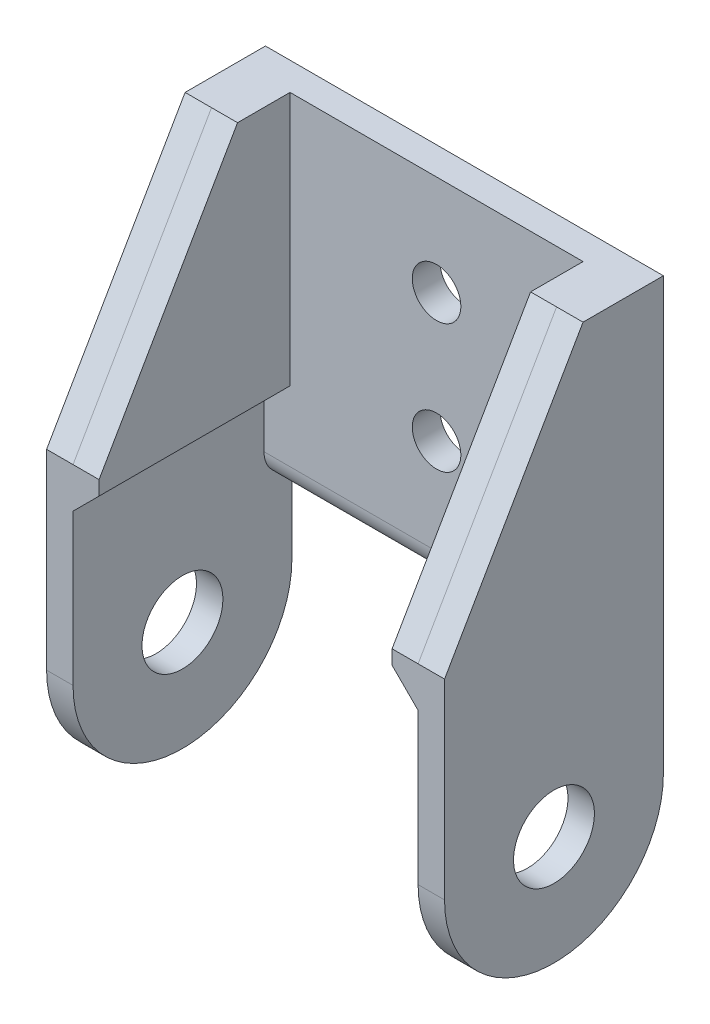
ISO-10303-21;
HEADER;
FILE_DESCRIPTION(('STEP AP214'),'2;1');
FILE_NAME('part.step','',(''),(''),'','','');
FILE_SCHEMA(('AUTOMOTIVE_DESIGN { 1 0 10303 214 1 1 1 1 }'));
ENDSEC;
DATA;
#1=APPLICATION_CONTEXT('core data for automotive mechanical design processes');
#2=APPLICATION_PROTOCOL_DEFINITION('international standard','automotive_design',2000,#1);
#3=PRODUCT_CONTEXT('',#1,'mechanical');
#4=PRODUCT('Part','Part','',(#3));
#5=PRODUCT_RELATED_PRODUCT_CATEGORY('part','',(#4));
#6=PRODUCT_DEFINITION_FORMATION('','',#4);
#7=PRODUCT_DEFINITION_CONTEXT('part definition',#1,'design');
#8=PRODUCT_DEFINITION('design','',#6,#7);
#9=PRODUCT_DEFINITION_SHAPE('','',#8);
#10=(LENGTH_UNIT() NAMED_UNIT(*) SI_UNIT(.MILLI.,.METRE.));
#11=(NAMED_UNIT(*) PLANE_ANGLE_UNIT() SI_UNIT($,.RADIAN.));
#12=(NAMED_UNIT(*) SI_UNIT($,.STERADIAN.) SOLID_ANGLE_UNIT());
#13=UNCERTAINTY_MEASURE_WITH_UNIT(LENGTH_MEASURE(1.E-05),#10,'distance_accuracy_value','');
#14=(GEOMETRIC_REPRESENTATION_CONTEXT(3) GLOBAL_UNCERTAINTY_ASSIGNED_CONTEXT((#13)) GLOBAL_UNIT_ASSIGNED_CONTEXT((#10,
#11,#12)) REPRESENTATION_CONTEXT('',''));
#15=CARTESIAN_POINT('',(0.,0.,0.));
#16=DIRECTION('',(0.,0.,1.));
#17=DIRECTION('',(1.,0.,0.));
#18=AXIS2_PLACEMENT_3D('',#15,#16,#17);
#19=CARTESIAN_POINT('',(95.6580659340659,19.9474999999992,15.4123940140867));
#20=DIRECTION('',(0.,1.,0.));
#21=DIRECTION('',(1.,0.,0.));
#22=AXIS2_PLACEMENT_3D('',#19,#20,#21);
#23=PLANE('',#22);
#24=CARTESIAN_POINT('',(-13.92,19.9475,0.));
#25=CARTESIAN_POINT('',(13.92,19.9475,0.));
#26=(BOUNDED_CURVE() B_SPLINE_CURVE(1,(#24,#25),.UNSPECIFIED.,.F.,
.F.) B_SPLINE_CURVE_WITH_KNOTS((2,2),(-0.182,0.),
.UNSPECIFIED.) CURVE() GEOMETRIC_REPRESENTATION_ITEM() RATIONAL_B_SPLINE_CURVE((1.,1.)) REPRESENTATION_ITEM(''));
#27=CARTESIAN_POINT('',(-12.07,19.9475,0.));
#28=VERTEX_POINT('',#27);
#29=CARTESIAN_POINT('',(12.07,19.9475000013429,-1.55333731988172E-09));
#30=VERTEX_POINT('',#29);
#31=EDGE_CURVE('E378',#28,#30,#26,.T.);
#32=ORIENTED_EDGE('',*,*,#31,.F.);
#33=DIRECTION('',(1.,0.,0.));
#34=VECTOR('',#33,1.);
#35=CARTESIAN_POINT('',(-13.92,19.9475,0.));
#36=LINE('',#35,#34);
#37=CARTESIAN_POINT('',(-13.92,19.9475,0.));
#38=VERTEX_POINT('',#37);
#39=EDGE_CURVE('E633',#38,#28,#36,.T.);
#40=ORIENTED_EDGE('',*,*,#39,.F.);
#41=DIRECTION('',(0.,0.,-1.));
#42=VECTOR('',#41,1.);
#43=CARTESIAN_POINT('',(-13.92,19.9475,0.));
#44=LINE('',#43,#42);
#45=CARTESIAN_POINT('',(-13.92,19.9475,5.62206248299806));
#46=VERTEX_POINT('',#45);
#47=EDGE_CURVE('E646',#46,#38,#44,.T.);
#48=ORIENTED_EDGE('',*,*,#47,.F.);
#49=DIRECTION('',(1.,0.,0.));
#50=VECTOR('',#49,1.);
#51=CARTESIAN_POINT('',(-13.92,19.9475,5.62206248299806));
#52=LINE('',#51,#50);
#53=CARTESIAN_POINT('',(-12.0700000001218,19.94748992602,5.62207179111741));
#54=VERTEX_POINT('',#53);
#55=EDGE_CURVE('E657',#46,#54,#52,.T.);
#56=ORIENTED_EDGE('',*,*,#55,.T.);
#57=CARTESIAN_POINT('',(-10.25,19.9474544202722,5.62208880461831));
#58=CARTESIAN_POINT('',(-11.4733333333332,19.9474696135148,5.62208003074489));
#59=CARTESIAN_POINT('',(-12.6966666666666,19.9474848067574,5.62207125687148));
#60=CARTESIAN_POINT('',(-13.92,19.9475,5.62206248299806));
#61=(BOUNDED_CURVE() B_SPLINE_CURVE(3,(#57,#58,#59,#60),.UNSPECIFIED.,.F.,
.F.) B_SPLINE_CURVE_WITH_KNOTS((4,4),(0.,1.82000000076109),
.UNSPECIFIED.) CURVE() GEOMETRIC_REPRESENTATION_ITEM() RATIONAL_B_SPLINE_CURVE((1.,1.,1.,1.)) REPRESENTATION_ITEM(''));
#62=CARTESIAN_POINT('',(-10.25,19.9474726521634,5.62207827597021));
#63=VERTEX_POINT('',#62);
#64=EDGE_CURVE('E373',#54,#63,#61,.F.);
#65=ORIENTED_EDGE('',*,*,#64,.T.);
#66=CARTESIAN_POINT('',(-10.25,19.9471392113303,1.94999997565309));
#67=DIRECTION('',(0.,9.08043904448818E-05,0.999999995877281));
#68=VECTOR('',#67,1.);
#69=LINE('',#66,#68);
#70=CARTESIAN_POINT('',(-10.25,19.9471392113303,1.94999997565309));
#71=VERTEX_POINT('',#70);
#72=EDGE_CURVE('E318',#71,#63,#69,.T.);
#73=ORIENTED_EDGE('',*,*,#72,.F.);
#74=CARTESIAN_POINT('',(-10.2500000000001,19.9474999999992,1.9499999756531));
#75=DIRECTION('',(1.,0.,0.));
#76=VECTOR('',#75,1.);
#77=LINE('',#74,#76);
#78=CARTESIAN_POINT('',(10.25,19.9471392113302,1.94999997565309));
#79=VERTEX_POINT('',#78);
#80=EDGE_CURVE('E13',#71,#79,#77,.T.);
#81=ORIENTED_EDGE('',*,*,#80,.T.);
#82=CARTESIAN_POINT('',(10.25,19.9474999999992,1.9499999756531));
#83=DIRECTION('',(0.,0.,1.));
#84=VECTOR('',#83,1.);
#85=LINE('',#82,#84);
#86=CARTESIAN_POINT('',(10.25,19.9474726521633,5.62207827597021));
#87=VERTEX_POINT('',#86);
#88=EDGE_CURVE('E64',#79,#87,#85,.T.);
#89=ORIENTED_EDGE('',*,*,#88,.T.);
#90=CARTESIAN_POINT('',(13.92,19.9475,5.62206248299806));
#91=CARTESIAN_POINT('',(12.6966666666666,19.9474848067574,5.62207125687148));
#92=CARTESIAN_POINT('',(11.4733333333332,19.9474696135148,5.62208003074489));
#93=CARTESIAN_POINT('',(10.25,19.9474544202722,5.62208880461831));
#94=(BOUNDED_CURVE() B_SPLINE_CURVE(3,(#90,#91,#92,#93),.UNSPECIFIED.,.F.,
.F.) B_SPLINE_CURVE_WITH_KNOTS((4,4),(0.,1.82000000076108),
.UNSPECIFIED.) CURVE() GEOMETRIC_REPRESENTATION_ITEM() RATIONAL_B_SPLINE_CURVE((1.,1.,1.,1.)) REPRESENTATION_ITEM(''));
#95=CARTESIAN_POINT('',(12.07,19.9474885122572,5.62206911700006));
#96=VERTEX_POINT('',#95);
#97=EDGE_CURVE('E939',#87,#96,#94,.F.);
#98=ORIENTED_EDGE('',*,*,#97,.T.);
#99=DIRECTION('',(-1.,0.,0.));
#100=VECTOR('',#99,1.);
#101=CARTESIAN_POINT('',(13.92,19.9475000013429,5.62206248377335));
#102=LINE('',#101,#100);
#103=CARTESIAN_POINT('',(13.92,19.9475000013429,5.62206248377335));
#104=VERTEX_POINT('',#103);
#105=EDGE_CURVE('E674',#104,#96,#102,.T.);
#106=ORIENTED_EDGE('',*,*,#105,.F.);
#107=DIRECTION('',(0.,0.,1.));
#108=VECTOR('',#107,1.);
#109=CARTESIAN_POINT('',(13.92,19.9475000013429,5.62206248377335));
#110=LINE('',#109,#108);
#111=CARTESIAN_POINT('',(13.92,19.9475000013429,-1.55333731988172E-09));
#112=VERTEX_POINT('',#111);
#113=EDGE_CURVE('E693',#112,#104,#110,.T.);
#114=ORIENTED_EDGE('',*,*,#113,.F.);
#115=DIRECTION('',(-1.,0.,0.));
#116=VECTOR('',#115,1.);
#117=CARTESIAN_POINT('',(13.92,19.9475000013429,-1.55333731988172E-09));
#118=LINE('',#117,#116);
#119=EDGE_CURVE('E671',#112,#30,#118,.T.);
#120=ORIENTED_EDGE('',*,*,#119,.T.);
#121=EDGE_LOOP('',(#32,#40,#48,#56,#65,#73,#81,#89,#98,#106,#114,#120));
#122=FACE_BOUND('',#121,.T.);
#123=ADVANCED_FACE('F53',(#122),#23,.T.);
#124=CARTESIAN_POINT('',(-16.269,-11.7925,0.));
#125=DIRECTION('',(0.,0.,-1.));
#126=DIRECTION('',(0.,-1.,0.));
#127=AXIS2_PLACEMENT_3D('',#124,#125,#126);
#128=PLANE('',#127);
#129=CARTESIAN_POINT('',(0.,3.9475,0.));
#130=DIRECTION('',(0.,0.,-1.));
#131=DIRECTION('',(-1.,0.,0.));
#132=AXIS2_PLACEMENT_3D('',#129,#130,#131);
#133=CIRCLE('',#132,1.7);
#134=CARTESIAN_POINT('',(-1.7,3.9475,0.));
#135=VERTEX_POINT('',#134);
#136=EDGE_CURVE('E704',#135,#135,#133,.T.);
#137=ORIENTED_EDGE('',*,*,#136,.F.);
#138=EDGE_LOOP('',(#137));
#139=FACE_BOUND('',#138,.T.);
#140=CARTESIAN_POINT('',(0.,12.9475,0.));
#141=DIRECTION('',(0.,0.,-1.));
#142=DIRECTION('',(-1.,0.,0.));
#143=AXIS2_PLACEMENT_3D('',#140,#141,#142);
#144=CIRCLE('',#143,1.7);
#145=CARTESIAN_POINT('',(-1.7,12.9475,0.));
#146=VERTEX_POINT('',#145);
#147=EDGE_CURVE('E701',#146,#146,#144,.T.);
#148=ORIENTED_EDGE('',*,*,#147,.F.);
#149=EDGE_LOOP('',(#148));
#150=FACE_BOUND('',#149,.T.);
#151=CARTESIAN_POINT('',(-12.07,-4.6825,0.));
#152=CARTESIAN_POINT('',(12.07,-4.6825,0.));
#153=(BOUNDED_CURVE() B_SPLINE_CURVE(1,(#151,#152),.UNSPECIFIED.,.F.,
.F.) B_SPLINE_CURVE_WITH_KNOTS((2,2),(55.538,57.452),
.UNSPECIFIED.) CURVE() GEOMETRIC_REPRESENTATION_ITEM() RATIONAL_B_SPLINE_CURVE((1.,1.)) REPRESENTATION_ITEM(''));
#154=CARTESIAN_POINT('',(-12.07,-4.6825,0.));
#155=VERTEX_POINT('',#154);
#156=CARTESIAN_POINT('',(12.07,-4.68249999999999,-1.55334015319048E-09));
#157=VERTEX_POINT('',#156);
#158=EDGE_CURVE('E288',#155,#157,#153,.T.);
#159=ORIENTED_EDGE('',*,*,#158,.F.);
#160=DIRECTION('',(0.,-1.,0.));
#161=VECTOR('',#160,1.);
#162=CARTESIAN_POINT('',(-12.07,-10.2125,0.));
#163=LINE('',#162,#161);
#164=CARTESIAN_POINT('',(-12.07,-10.2125,0.));
#165=VERTEX_POINT('',#164);
#166=EDGE_CURVE('E650',#155,#165,#163,.T.);
#167=ORIENTED_EDGE('',*,*,#166,.T.);
#168=DIRECTION('',(1.,0.,0.));
#169=VECTOR('',#168,1.);
#170=CARTESIAN_POINT('',(-13.92,-10.2125,0.));
#171=LINE('',#170,#169);
#172=CARTESIAN_POINT('',(-13.92,-10.2125,0.));
#173=VERTEX_POINT('',#172);
#174=EDGE_CURVE('E636',#173,#165,#171,.T.);
#175=ORIENTED_EDGE('',*,*,#174,.F.);
#176=DIRECTION('',(0.,-1.,0.));
#177=VECTOR('',#176,1.);
#178=CARTESIAN_POINT('',(-13.92,-10.2125,0.));
#179=LINE('',#178,#177);
#180=EDGE_CURVE('E664',#38,#173,#179,.T.);
#181=ORIENTED_EDGE('',*,*,#180,.F.);
#182=ORIENTED_EDGE('',*,*,#39,.T.);
#183=ORIENTED_EDGE('',*,*,#31,.T.);
#184=ORIENTED_EDGE('',*,*,#119,.F.);
#185=DIRECTION('',(0.,1.,0.));
#186=VECTOR('',#185,1.);
#187=CARTESIAN_POINT('',(13.92,19.9475000013429,-1.55333731988172E-09));
#188=LINE('',#187,#186);
#189=CARTESIAN_POINT('',(13.92,-10.2124598604408,-1.55334078932867E-09));
#190=VERTEX_POINT('',#189);
#191=EDGE_CURVE('E696',#190,#112,#188,.T.);
#192=ORIENTED_EDGE('',*,*,#191,.F.);
#193=DIRECTION('',(-1.,0.,0.));
#194=VECTOR('',#193,1.);
#195=CARTESIAN_POINT('',(13.92,-10.2124598604408,-1.55334078932867E-09));
#196=LINE('',#195,#194);
#197=CARTESIAN_POINT('',(12.07,-10.2124598604408,-1.55334078932867E-09));
#198=VERTEX_POINT('',#197);
#199=EDGE_CURVE('E653',#190,#198,#196,.T.);
#200=ORIENTED_EDGE('',*,*,#199,.T.);
#201=DIRECTION('',(0.,1.,0.));
#202=VECTOR('',#201,1.);
#203=CARTESIAN_POINT('',(12.07,19.9475000013429,-1.55333731988172E-09));
#204=LINE('',#203,#202);
#205=EDGE_CURVE('E682',#198,#157,#204,.T.);
#206=ORIENTED_EDGE('',*,*,#205,.T.);
#207=EDGE_LOOP('',(#159,#167,#175,#181,#182,#183,#184,#192,#200,#206));
#208=FACE_BOUND('',#207,.T.);
#209=ADVANCED_FACE('F348',(#139,#150,#208),#128,.T.);
#210=CARTESIAN_POINT('',(-13.92,10.2629827701714,15.31));
#211=DIRECTION('',(0.,0.,1.));
#212=DIRECTION('',(1.,0.,0.));
#213=AXIS2_PLACEMENT_3D('',#210,#211,#212);
#214=PLANE('',#213);
#215=CARTESIAN_POINT('',(-13.92,3.1675,15.31));
#216=CARTESIAN_POINT('',(-12.07,3.1675,15.31));
#217=CARTESIAN_POINT('',(-10.25,3.1675,15.31));
#218=(BOUNDED_CURVE() B_SPLINE_CURVE(1,(#215,#216,#217),.UNSPECIFIED.,.F.,
.F.) B_SPLINE_CURVE_WITH_KNOTS((2,1,2),(-1.82000000076109,-0.902561308279338,0.),
.UNSPECIFIED.) CURVE() GEOMETRIC_REPRESENTATION_ITEM() RATIONAL_B_SPLINE_CURVE((1.,1.,1.)) REPRESENTATION_ITEM(''));
#219=CARTESIAN_POINT('',(-12.07,3.1675,15.31));
#220=VERTEX_POINT('',#219);
#221=CARTESIAN_POINT('',(-10.25,3.1675,15.31));
#222=VERTEX_POINT('',#221);
#223=EDGE_CURVE('E375',#220,#222,#218,.T.);
#224=ORIENTED_EDGE('',*,*,#223,.F.);
#225=DIRECTION('',(1.,0.,0.));
#226=VECTOR('',#225,1.);
#227=CARTESIAN_POINT('',(-13.92,3.1675,15.31));
#228=LINE('',#227,#226);
#229=CARTESIAN_POINT('',(-13.92,3.1675,15.31));
#230=VERTEX_POINT('',#229);
#231=EDGE_CURVE('E642',#230,#220,#228,.T.);
#232=ORIENTED_EDGE('',*,*,#231,.F.);
#233=DIRECTION('',(0.,1.,0.));
#234=VECTOR('',#233,1.);
#235=CARTESIAN_POINT('',(-13.92,3.1675,15.31));
#236=LINE('',#235,#234);
#237=CARTESIAN_POINT('',(-13.92,-10.2125,15.31));
#238=VERTEX_POINT('',#237);
#239=EDGE_CURVE('E658',#238,#230,#236,.T.);
#240=ORIENTED_EDGE('',*,*,#239,.F.);
#241=DIRECTION('',(1.,0.,0.));
#242=VECTOR('',#241,1.);
#243=CARTESIAN_POINT('',(-13.92,-10.2125,15.31));
#244=LINE('',#243,#242);
#245=CARTESIAN_POINT('',(-12.07,-10.2125,15.31));
#246=VERTEX_POINT('',#245);
#247=EDGE_CURVE('E639',#238,#246,#244,.T.);
#248=ORIENTED_EDGE('',*,*,#247,.T.);
#249=DIRECTION('',(0.,1.,0.));
#250=VECTOR('',#249,1.);
#251=CARTESIAN_POINT('',(-12.07,3.1675,15.31));
#252=LINE('',#251,#250);
#253=CARTESIAN_POINT('',(-12.07,0.347499999999975,15.31));
#254=VERTEX_POINT('',#253);
#255=EDGE_CURVE('E643',#246,#254,#252,.T.);
#256=ORIENTED_EDGE('',*,*,#255,.T.);
#257=CARTESIAN_POINT('',(-10.25,2.1675,15.31));
#258=CARTESIAN_POINT('',(-12.07,0.347499999999975,15.31));
#259=(BOUNDED_CURVE() B_SPLINE_CURVE(1,(#257,#258),.UNSPECIFIED.,.F.,
.F.) B_SPLINE_CURVE_WITH_KNOTS((2,2),(-2.57386868351903,0.),
.UNSPECIFIED.) CURVE() GEOMETRIC_REPRESENTATION_ITEM() RATIONAL_B_SPLINE_CURVE((1.,1.)) REPRESENTATION_ITEM(''));
#260=CARTESIAN_POINT('',(-10.25,2.1675,15.31));
#261=VERTEX_POINT('',#260);
#262=EDGE_CURVE('E876',#261,#254,#259,.T.);
#263=ORIENTED_EDGE('',*,*,#262,.F.);
#264=CARTESIAN_POINT('',(-10.25,3.1675,15.31));
#265=CARTESIAN_POINT('',(-10.25,2.1675,15.31));
#266=(BOUNDED_CURVE() B_SPLINE_CURVE(1,(#264,#265),.UNSPECIFIED.,.F.,
.F.) B_SPLINE_CURVE_WITH_KNOTS((2,2),(1.03100000076109,1.13100000076109),
.UNSPECIFIED.) CURVE() GEOMETRIC_REPRESENTATION_ITEM() RATIONAL_B_SPLINE_CURVE((1.,1.)) REPRESENTATION_ITEM(''));
#267=EDGE_CURVE('E72',#222,#261,#266,.T.);
#268=ORIENTED_EDGE('',*,*,#267,.F.);
#269=EDGE_LOOP('',(#224,#232,#240,#248,#256,#263,#268));
#270=FACE_BOUND('',#269,.T.);
#271=ADVANCED_FACE('F346',(#270),#214,.T.);
#272=CARTESIAN_POINT('',(-10.25,3.1675,15.31));
#273=CARTESIAN_POINT('',(-11.4733333333333,3.1675,15.31));
#274=CARTESIAN_POINT('',(-12.6966666666667,3.1675,15.31));
#275=CARTESIAN_POINT('',(-13.92,3.1675,15.31));
#276=CARTESIAN_POINT('',(-10.25,19.9474544202722,5.62208880461831));
#277=CARTESIAN_POINT('',(-11.4733333333332,19.9474696135148,5.62208003074489));
#278=CARTESIAN_POINT('',(-12.6966666666666,19.9474848067574,5.62207125687148));
#279=CARTESIAN_POINT('',(-13.92,19.9475,5.62206248299806));
#280=(BOUNDED_SURFACE() B_SPLINE_SURFACE(1,3,((#272,#273,#274,#275),(#276,#277,#278,#279)),
.UNSPECIFIED.,.F.,.F.,.F.) B_SPLINE_SURFACE_WITH_KNOTS((2,2),(4,4),(0.,19.3758750340038),(0.,
1.82000000076109),.UNSPECIFIED.) GEOMETRIC_REPRESENTATION_ITEM() RATIONAL_B_SPLINE_SURFACE(((1.,
1.,1.,1.),(1.,1.,1.,1.))) REPRESENTATION_ITEM('') SURFACE());
#281=CARTESIAN_POINT('',(-12.07,3.1675,15.31));
#282=CARTESIAN_POINT('',(-12.07,19.9475,5.62206248299806));
#283=(BOUNDED_CURVE() B_SPLINE_CURVE(1,(#281,#282),.UNSPECIFIED.,.F.,
.F.) B_SPLINE_CURVE_WITH_KNOTS((2,2),(0.,19.3758750340038),
.UNSPECIFIED.) CURVE() GEOMETRIC_REPRESENTATION_ITEM() RATIONAL_B_SPLINE_CURVE((1.,1.)) REPRESENTATION_ITEM(''));
#284=EDGE_CURVE('E627',#220,#54,#283,.T.);
#285=CARTESIAN_POINT('',(-10.25,19.9474726521634,5.62207827597021));
#286=CARTESIAN_POINT('',(-10.25,3.1675,15.31));
#287=(BOUNDED_CURVE() B_SPLINE_CURVE(1,(#285,#286),.UNSPECIFIED.,.F.,
.F.) B_SPLINE_CURVE_WITH_KNOTS((2,2),(-19.3758750340038,0.),
.UNSPECIFIED.) CURVE() GEOMETRIC_REPRESENTATION_ITEM() RATIONAL_B_SPLINE_CURVE((1.,1.)) REPRESENTATION_ITEM(''));
#288=EDGE_CURVE('E309',#63,#222,#287,.T.);
#289=ORIENTED_EDGE('',*,*,#64,.F.);
#290=ORIENTED_EDGE('',*,*,#284,.F.);
#291=ORIENTED_EDGE('',*,*,#223,.T.);
#292=ORIENTED_EDGE('',*,*,#288,.F.);
#293=EDGE_LOOP('',(#289,#290,#291,#292));
#294=FACE_BOUND('',#293,.T.);
#295=ADVANCED_FACE('F340',(#294),#280,.T.);
#296=CARTESIAN_POINT('',(-13.92,10.2629827701714,15.31));
#297=DIRECTION('',(0.,0.,1.));
#298=DIRECTION('',(1.,0.,0.));
#299=AXIS2_PLACEMENT_3D('',#296,#297,#298);
#300=PLANE('',#299);
#301=CARTESIAN_POINT('',(12.07,0.347499999999975,15.31));
#302=CARTESIAN_POINT('',(10.25,2.1675,15.31));
#303=(BOUNDED_CURVE() B_SPLINE_CURVE(1,(#301,#302),.UNSPECIFIED.,.F.,
.F.) B_SPLINE_CURVE_WITH_KNOTS((2,2),(0.,2.57386868351903),
.UNSPECIFIED.) CURVE() GEOMETRIC_REPRESENTATION_ITEM() RATIONAL_B_SPLINE_CURVE((1.,1.)) REPRESENTATION_ITEM(''));
#304=CARTESIAN_POINT('',(12.07,0.347499999999962,15.3100000013433));
#305=VERTEX_POINT('',#304);
#306=CARTESIAN_POINT('',(10.25,2.1675,15.31));
#307=VERTEX_POINT('',#306);
#308=EDGE_CURVE('E103',#305,#307,#303,.T.);
#309=ORIENTED_EDGE('',*,*,#308,.F.);
#310=DIRECTION('',(0.,-1.,0.));
#311=VECTOR('',#310,1.);
#312=CARTESIAN_POINT('',(12.07,-10.2124598604409,15.3100000013429));
#313=LINE('',#312,#311);
#314=CARTESIAN_POINT('',(12.07,-10.2124598604409,15.3100000013429));
#315=VERTEX_POINT('',#314);
#316=EDGE_CURVE('E679',#305,#315,#313,.T.);
#317=ORIENTED_EDGE('',*,*,#316,.T.);
#318=DIRECTION('',(-1.,0.,0.));
#319=VECTOR('',#318,1.);
#320=CARTESIAN_POINT('',(13.92,-10.2124598604409,15.3100000013429));
#321=LINE('',#320,#319);
#322=CARTESIAN_POINT('',(13.92,-10.2124598604409,15.3100000013429));
#323=VERTEX_POINT('',#322);
#324=EDGE_CURVE('E675',#323,#315,#321,.T.);
#325=ORIENTED_EDGE('',*,*,#324,.F.);
#326=DIRECTION('',(0.,-1.,0.));
#327=VECTOR('',#326,1.);
#328=CARTESIAN_POINT('',(13.92,-10.2124598604409,15.3100000013429));
#329=LINE('',#328,#327);
#330=CARTESIAN_POINT('',(13.92,3.16750000035982,15.3100000013429));
#331=VERTEX_POINT('',#330);
#332=EDGE_CURVE('E678',#331,#323,#329,.T.);
#333=ORIENTED_EDGE('',*,*,#332,.F.);
#334=DIRECTION('',(-1.,0.,0.));
#335=VECTOR('',#334,1.);
#336=CARTESIAN_POINT('',(13.92,3.16750000035982,15.3100000013429));
#337=LINE('',#336,#335);
#338=CARTESIAN_POINT('',(12.07,3.16750000035982,15.3100000013429));
#339=VERTEX_POINT('',#338);
#340=EDGE_CURVE('E672',#331,#339,#337,.T.);
#341=ORIENTED_EDGE('',*,*,#340,.T.);
#342=CARTESIAN_POINT('',(10.25,3.1675,15.31));
#343=CARTESIAN_POINT('',(12.07,3.1675,15.31));
#344=CARTESIAN_POINT('',(13.92,3.1675,15.31));
#345=(BOUNDED_CURVE() B_SPLINE_CURVE(1,(#342,#343,#344),.UNSPECIFIED.,.F.,
.F.) B_SPLINE_CURVE_WITH_KNOTS((2,1,2),(-1.82000000076108,-0.917438692481745,0.),
.UNSPECIFIED.) CURVE() GEOMETRIC_REPRESENTATION_ITEM() RATIONAL_B_SPLINE_CURVE((1.,1.,1.)) REPRESENTATION_ITEM(''));
#346=CARTESIAN_POINT('',(10.25,3.1675,15.31));
#347=VERTEX_POINT('',#346);
#348=EDGE_CURVE('E107',#347,#339,#345,.T.);
#349=ORIENTED_EDGE('',*,*,#348,.F.);
#350=CARTESIAN_POINT('',(10.25,2.1675,15.31));
#351=CARTESIAN_POINT('',(10.25,3.1675,15.31));
#352=(BOUNDED_CURVE() B_SPLINE_CURVE(1,(#350,#351),.UNSPECIFIED.,.F.,
.F.) B_SPLINE_CURVE_WITH_KNOTS((2,2),(4.35386868351903,4.45386868351903),
.UNSPECIFIED.) CURVE() GEOMETRIC_REPRESENTATION_ITEM() RATIONAL_B_SPLINE_CURVE((1.,1.)) REPRESENTATION_ITEM(''));
#353=EDGE_CURVE('E98',#307,#347,#352,.T.);
#354=ORIENTED_EDGE('',*,*,#353,.F.);
#355=EDGE_LOOP('',(#309,#317,#325,#333,#341,#349,#354));
#356=FACE_BOUND('',#355,.T.);
#357=ADVANCED_FACE('F100',(#356),#300,.T.);
#358=CARTESIAN_POINT('',(13.92,3.1675,15.31));
#359=CARTESIAN_POINT('',(12.6966666666667,3.1675,15.31));
#360=CARTESIAN_POINT('',(11.4733333333333,3.1675,15.31));
#361=CARTESIAN_POINT('',(10.25,3.1675,15.31));
#362=CARTESIAN_POINT('',(13.92,19.9475,5.62206248299806));
#363=CARTESIAN_POINT('',(12.6966666666666,19.9474848067574,5.62207125687148));
#364=CARTESIAN_POINT('',(11.4733333333332,19.9474696135148,5.62208003074489));
#365=CARTESIAN_POINT('',(10.25,19.9474544202722,5.62208880461831));
#366=(BOUNDED_SURFACE() B_SPLINE_SURFACE(1,3,((#358,#359,#360,#361),(#362,#363,#364,#365)),
.UNSPECIFIED.,.F.,.F.,.F.) B_SPLINE_SURFACE_WITH_KNOTS((2,2),(4,4),(0.,19.3758750340038),(0.,
1.82000000076108),.UNSPECIFIED.) GEOMETRIC_REPRESENTATION_ITEM() RATIONAL_B_SPLINE_SURFACE(((1.,
1.,1.,1.),(1.,1.,1.,1.))) REPRESENTATION_ITEM('') SURFACE());
#367=CARTESIAN_POINT('',(12.07,3.16750000035982,15.3100000013429));
#368=CARTESIAN_POINT('',(12.07,4.45268169957763,14.5680000013458));
#369=CARTESIAN_POINT('',(12.07,5.73786339879465,13.8260000013474));
#370=CARTESIAN_POINT('',(12.07,9.17712091523428,11.840343748421));
#371=CARTESIAN_POINT('',(12.07,11.331196732456,10.5966874954914));
#372=CARTESIAN_POINT('',(12.07,15.639348366899,8.10937498963165));
#373=CARTESIAN_POINT('',(12.07,17.7934241841204,6.86571873670152));
#374=CARTESIAN_POINT('',(12.07,19.9475000013429,5.62206248377335));
#375=B_SPLINE_CURVE_WITH_KNOTS('',3,(#367,#368,#369,#370,#371,#372,#373,#374),.UNSPECIFIED.,.F.,
.F.,(4,2,2,4),(0.,4.452,11.9139375175695,19.375875035139),.UNSPECIFIED.);
#376=EDGE_CURVE('E603',#339,#96,#375,.T.);
#377=CARTESIAN_POINT('',(10.25,3.1675,15.31));
#378=CARTESIAN_POINT('',(10.25,19.9474726521633,5.62207827597021));
#379=(BOUNDED_CURVE() B_SPLINE_CURVE(1,(#377,#378),.UNSPECIFIED.,.F.,
.F.) B_SPLINE_CURVE_WITH_KNOTS((2,2),(0.,19.3758750340038),
.UNSPECIFIED.) CURVE() GEOMETRIC_REPRESENTATION_ITEM() RATIONAL_B_SPLINE_CURVE((1.,1.)) REPRESENTATION_ITEM(''));
#380=EDGE_CURVE('E114',#347,#87,#379,.T.);
#381=ORIENTED_EDGE('',*,*,#348,.T.);
#382=ORIENTED_EDGE('',*,*,#376,.T.);
#383=ORIENTED_EDGE('',*,*,#97,.F.);
#384=ORIENTED_EDGE('',*,*,#380,.F.);
#385=EDGE_LOOP('',(#381,#382,#383,#384));
#386=FACE_BOUND('',#385,.T.);
#387=ADVANCED_FACE('F938',(#386),#366,.T.);
#388=CARTESIAN_POINT('',(-17.0691047558312,-4.65160475583124,15.31));
#389=DIRECTION('',(0.707106781186547,-0.707106781186548,0.));
#390=DIRECTION('',(0.,0.,-1.));
#391=AXIS2_PLACEMENT_3D('',#388,#389,#390);
#392=PLANE('',#391);
#393=CARTESIAN_POINT('',(-12.07,0.347499999999975,1.95));
#394=CARTESIAN_POINT('',(-12.07,0.347499999999975,13.34));
#395=CARTESIAN_POINT('',(-12.07,0.347499999999975,15.31));
#396=(BOUNDED_CURVE() B_SPLINE_CURVE(1,(#393,#394,#395),.UNSPECIFIED.,.F.,
.F.) B_SPLINE_CURVE_WITH_KNOTS((2,1,2),(-1.139,0.,0.197),
.UNSPECIFIED.) CURVE() GEOMETRIC_REPRESENTATION_ITEM() RATIONAL_B_SPLINE_CURVE((1.,1.,1.)) REPRESENTATION_ITEM(''));
#397=CARTESIAN_POINT('',(-12.07,0.347499999999974,1.95));
#398=VERTEX_POINT('',#397);
#399=EDGE_CURVE('E124',#398,#254,#396,.T.);
#400=ORIENTED_EDGE('',*,*,#399,.F.);
#401=CARTESIAN_POINT('',(-10.25,2.1675,1.95));
#402=CARTESIAN_POINT('',(-12.07,0.347499999999975,1.95));
#403=(BOUNDED_CURVE() B_SPLINE_CURVE(1,(#401,#402),.UNSPECIFIED.,.F.,
.F.) B_SPLINE_CURVE_WITH_KNOTS((2,2),(0.,0.257386868351903),
.UNSPECIFIED.) CURVE() GEOMETRIC_REPRESENTATION_ITEM() RATIONAL_B_SPLINE_CURVE((1.,1.)) REPRESENTATION_ITEM(''));
#404=CARTESIAN_POINT('',(-10.25,2.1675,1.95));
#405=VERTEX_POINT('',#404);
#406=EDGE_CURVE('E139',#405,#398,#403,.T.);
#407=ORIENTED_EDGE('',*,*,#406,.F.);
#408=CARTESIAN_POINT('',(-10.25,2.1675,15.31));
#409=CARTESIAN_POINT('',(-10.25,2.1675,13.34));
#410=CARTESIAN_POINT('',(-10.25,2.1675,1.95));
#411=(BOUNDED_CURVE() B_SPLINE_CURVE(1,(#408,#409,#410),.UNSPECIFIED.,.F.,
.F.) B_SPLINE_CURVE_WITH_KNOTS((2,1,2),(-0.7655,-0.5685,0.5705),
.UNSPECIFIED.) CURVE() GEOMETRIC_REPRESENTATION_ITEM() RATIONAL_B_SPLINE_CURVE((1.,1.,1.)) REPRESENTATION_ITEM(''));
#412=EDGE_CURVE('E818',#261,#405,#411,.T.);
#413=ORIENTED_EDGE('',*,*,#412,.F.);
#414=ORIENTED_EDGE('',*,*,#262,.T.);
#415=EDGE_LOOP('',(#400,#407,#413,#414));
#416=FACE_BOUND('',#415,.T.);
#417=ADVANCED_FACE('F55',(#416),#392,.T.);
#418=CARTESIAN_POINT('',(-10.25,2.1675,0.));
#419=DIRECTION('',(1.,0.,0.));
#420=DIRECTION('',(0.,1.,0.));
#421=AXIS2_PLACEMENT_3D('',#418,#419,#420);
#422=PLANE('',#421);
#423=ORIENTED_EDGE('',*,*,#288,.T.);
#424=ORIENTED_EDGE('',*,*,#267,.T.);
#425=ORIENTED_EDGE('',*,*,#412,.T.);
#426=CARTESIAN_POINT('',(-10.25,2.1675,1.95));
#427=CARTESIAN_POINT('',(-10.25,4.61752485824371,1.94999999664501));
#428=CARTESIAN_POINT('',(-10.25,13.1176111011301,1.94999998500524));
#429=CARTESIAN_POINT('',(-10.25,19.9471392113303,1.94999997565309));
#430=(BOUNDED_CURVE() B_SPLINE_CURVE(1,(#426,#427,#428,#429),.UNSPECIFIED.,.F.,
.F.) B_SPLINE_CURVE_WITH_KNOTS((2,1,1,2),(-0.245,0.,0.85,1.45),
.UNSPECIFIED.) CURVE() GEOMETRIC_REPRESENTATION_ITEM() RATIONAL_B_SPLINE_CURVE((1.,1.,1.,1.)) REPRESENTATION_ITEM(''));
#431=EDGE_CURVE('E892',#405,#71,#430,.T.);
#432=ORIENTED_EDGE('',*,*,#431,.T.);
#433=ORIENTED_EDGE('',*,*,#72,.T.);
#434=EDGE_LOOP('',(#423,#424,#425,#432,#433));
#435=FACE_BOUND('',#434,.T.);
#436=ADVANCED_FACE('F327',(#435),#422,.T.);
#437=CARTESIAN_POINT('',(17.0691047558312,-4.65160475583123,15.31));
#438=DIRECTION('',(-0.707106781186547,-0.707106781186548,0.));
#439=DIRECTION('',(-0.707106781186548,0.707106781186547,0.));
#440=AXIS2_PLACEMENT_3D('',#437,#438,#439);
#441=PLANE('',#440);
#442=ORIENTED_EDGE('',*,*,#308,.T.);
#443=CARTESIAN_POINT('',(10.25,2.1675,15.31));
#444=CARTESIAN_POINT('',(10.25,2.1675,13.34));
#445=CARTESIAN_POINT('',(10.25,2.1675,1.95));
#446=(BOUNDED_CURVE() B_SPLINE_CURVE(1,(#443,#444,#445),.UNSPECIFIED.,.F.,
.F.) B_SPLINE_CURVE_WITH_KNOTS((2,1,2),(-0.7655,-0.5685,0.5705),
.UNSPECIFIED.) CURVE() GEOMETRIC_REPRESENTATION_ITEM() RATIONAL_B_SPLINE_CURVE((1.,1.,1.)) REPRESENTATION_ITEM(''));
#447=CARTESIAN_POINT('',(10.25,2.1675,1.95));
#448=VERTEX_POINT('',#447);
#449=EDGE_CURVE('E120',#307,#448,#446,.T.);
#450=ORIENTED_EDGE('',*,*,#449,.T.);
#451=CARTESIAN_POINT('',(12.07,0.347499999999975,1.95));
#452=CARTESIAN_POINT('',(10.25,2.1675,1.95));
#453=(BOUNDED_CURVE() B_SPLINE_CURVE(1,(#451,#452),.UNSPECIFIED.,.F.,
.F.) B_SPLINE_CURVE_WITH_KNOTS((2,2),(-0.257386868351903,0.),
.UNSPECIFIED.) CURVE() GEOMETRIC_REPRESENTATION_ITEM() RATIONAL_B_SPLINE_CURVE((1.,1.)) REPRESENTATION_ITEM(''));
#454=CARTESIAN_POINT('',(12.07,0.347499999999975,1.95));
#455=VERTEX_POINT('',#454);
#456=EDGE_CURVE('E807',#455,#448,#453,.T.);
#457=ORIENTED_EDGE('',*,*,#456,.F.);
#458=CARTESIAN_POINT('',(12.07,0.347499999999975,1.95));
#459=CARTESIAN_POINT('',(12.07,0.347499999999975,13.34));
#460=CARTESIAN_POINT('',(12.07,0.347499999999975,15.31));
#461=(BOUNDED_CURVE() B_SPLINE_CURVE(1,(#458,#459,#460),.UNSPECIFIED.,.F.,
.F.) B_SPLINE_CURVE_WITH_KNOTS((2,1,2),(-1.139,0.,0.197),
.UNSPECIFIED.) CURVE() GEOMETRIC_REPRESENTATION_ITEM() RATIONAL_B_SPLINE_CURVE((1.,1.,1.)) REPRESENTATION_ITEM(''));
#462=EDGE_CURVE('E113',#455,#305,#461,.T.);
#463=ORIENTED_EDGE('',*,*,#462,.T.);
#464=EDGE_LOOP('',(#442,#450,#457,#463));
#465=FACE_BOUND('',#464,.T.);
#466=ADVANCED_FACE('F118',(#465),#441,.T.);
#467=CARTESIAN_POINT('',(10.25,2.1675,0.));
#468=DIRECTION('',(-1.,0.,0.));
#469=DIRECTION('',(0.,0.,1.));
#470=AXIS2_PLACEMENT_3D('',#467,#468,#469);
#471=PLANE('',#470);
#472=ORIENTED_EDGE('',*,*,#88,.F.);
#473=CARTESIAN_POINT('',(10.25,2.1675,1.95));
#474=CARTESIAN_POINT('',(10.25,4.61752485824371,1.94999999664501));
#475=CARTESIAN_POINT('',(10.25,13.1176111011301,1.94999998500524));
#476=CARTESIAN_POINT('',(10.25,19.9471392113302,1.94999997565309));
#477=(BOUNDED_CURVE() B_SPLINE_CURVE(1,(#473,#474,#475,#476),.UNSPECIFIED.,.F.,
.F.) B_SPLINE_CURVE_WITH_KNOTS((2,1,1,2),(-0.245,0.,0.85,1.45),
.UNSPECIFIED.) CURVE() GEOMETRIC_REPRESENTATION_ITEM() RATIONAL_B_SPLINE_CURVE((1.,1.,1.,1.)) REPRESENTATION_ITEM(''));
#478=EDGE_CURVE('E128',#448,#79,#477,.T.);
#479=ORIENTED_EDGE('',*,*,#478,.F.);
#480=ORIENTED_EDGE('',*,*,#449,.F.);
#481=ORIENTED_EDGE('',*,*,#353,.T.);
#482=ORIENTED_EDGE('',*,*,#380,.T.);
#483=EDGE_LOOP('',(#472,#479,#480,#481,#482));
#484=FACE_BOUND('',#483,.T.);
#485=ADVANCED_FACE('F126',(#484),#471,.T.);
#486=CARTESIAN_POINT('',(-13.277,-3.1,1.95));
#487=DIRECTION('',(0.,0.,1.));
#488=DIRECTION('',(1.,0.,0.));
#489=AXIS2_PLACEMENT_3D('',#486,#487,#488);
#490=PLANE('',#489);
#491=CARTESIAN_POINT('',(0.,3.9475,1.95));
#492=DIRECTION('',(0.,0.,1.));
#493=DIRECTION('',(1.,0.,0.));
#494=AXIS2_PLACEMENT_3D('',#491,#492,#493);
#495=CIRCLE('',#494,1.7);
#496=CARTESIAN_POINT('',(1.7,3.9475,1.95));
#497=VERTEX_POINT('',#496);
#498=EDGE_CURVE('E57',#497,#497,#495,.T.);
#499=ORIENTED_EDGE('',*,*,#498,.F.);
#500=EDGE_LOOP('',(#499));
#501=FACE_BOUND('',#500,.T.);
#502=CARTESIAN_POINT('',(0.,12.9475,1.95));
#503=DIRECTION('',(0.,0.,1.));
#504=DIRECTION('',(1.,0.,0.));
#505=AXIS2_PLACEMENT_3D('',#502,#503,#504);
#506=CIRCLE('',#505,1.7);
#507=CARTESIAN_POINT('',(1.7,12.9475,1.95));
#508=VERTEX_POINT('',#507);
#509=EDGE_CURVE('E708',#508,#508,#506,.T.);
#510=ORIENTED_EDGE('',*,*,#509,.F.);
#511=EDGE_LOOP('',(#510));
#512=FACE_BOUND('',#511,.T.);
#513=CARTESIAN_POINT('',(12.07,-2.7325,1.95));
#514=CARTESIAN_POINT('',(-12.07,-2.7325,1.95));
#515=(BOUNDED_CURVE() B_SPLINE_CURVE(1,(#513,#514),.UNSPECIFIED.,.F.,
.F.) B_SPLINE_CURVE_WITH_KNOTS((2,2),(0.,1.914),
.UNSPECIFIED.) CURVE() GEOMETRIC_REPRESENTATION_ITEM() RATIONAL_B_SPLINE_CURVE((1.,1.)) REPRESENTATION_ITEM(''));
#516=CARTESIAN_POINT('',(12.07,-2.7325,1.95));
#517=VERTEX_POINT('',#516);
#518=CARTESIAN_POINT('',(-12.07,-2.73250000000004,1.95));
#519=VERTEX_POINT('',#518);
#520=EDGE_CURVE('E283',#517,#519,#515,.T.);
#521=ORIENTED_EDGE('',*,*,#520,.F.);
#522=CARTESIAN_POINT('',(12.07,-2.7325,1.95));
#523=CARTESIAN_POINT('',(12.07,0.347499999999975,1.95));
#524=(BOUNDED_CURVE() B_SPLINE_CURVE(1,(#522,#523),.UNSPECIFIED.,.F.,
.F.) B_SPLINE_CURVE_WITH_KNOTS((2,2),(-0.308,0.),
.UNSPECIFIED.) CURVE() GEOMETRIC_REPRESENTATION_ITEM() RATIONAL_B_SPLINE_CURVE((1.,1.)) REPRESENTATION_ITEM(''));
#525=EDGE_CURVE('E167',#517,#455,#524,.T.);
#526=ORIENTED_EDGE('',*,*,#525,.T.);
#527=ORIENTED_EDGE('',*,*,#456,.T.);
#528=ORIENTED_EDGE('',*,*,#478,.T.);
#529=ORIENTED_EDGE('',*,*,#80,.F.);
#530=ORIENTED_EDGE('',*,*,#431,.F.);
#531=ORIENTED_EDGE('',*,*,#406,.T.);
#532=CARTESIAN_POINT('',(-12.07,-2.7325,1.95));
#533=CARTESIAN_POINT('',(-12.07,0.347499999999975,1.95));
#534=(BOUNDED_CURVE() B_SPLINE_CURVE(1,(#532,#533),.UNSPECIFIED.,.F.,
.F.) B_SPLINE_CURVE_WITH_KNOTS((2,2),(-0.308,0.),
.UNSPECIFIED.) CURVE() GEOMETRIC_REPRESENTATION_ITEM() RATIONAL_B_SPLINE_CURVE((1.,1.)) REPRESENTATION_ITEM(''));
#535=EDGE_CURVE('E282',#519,#398,#534,.T.);
#536=ORIENTED_EDGE('',*,*,#535,.F.);
#537=EDGE_LOOP('',(#521,#526,#527,#528,#529,#530,#531,#536));
#538=FACE_BOUND('',#537,.T.);
#539=ADVANCED_FACE('F337',(#501,#512,#538),#490,.T.);
#540=CARTESIAN_POINT('',(-14.6353479623825,-2.73250000000004,1.95));
#541=CARTESIAN_POINT('',(14.6353479623825,-2.7325,1.95));
#542=CARTESIAN_POINT('',(-14.6353479623825,-4.68250000000003,1.95));
#543=CARTESIAN_POINT('',(14.6353479623824,-4.6825,1.95));
#544=CARTESIAN_POINT('',(-14.6353479623824,-4.6825,0.));
#545=CARTESIAN_POINT('',(14.6353479623825,-4.6825,0.));
#546=(BOUNDED_SURFACE() B_SPLINE_SURFACE(2,1,((#540,#541),(#542,#543),(#544,#545)),
.UNSPECIFIED.,.F.,.F.,.F.) B_SPLINE_SURFACE_WITH_KNOTS((3,3),(2,2),(1.5707963267949,
3.14159265358979),(0.,2.3208),
.UNSPECIFIED.) GEOMETRIC_REPRESENTATION_ITEM() RATIONAL_B_SPLINE_SURFACE(((1.,1.),
(0.707106781186548,0.707106781186548),(1.,1.))) REPRESENTATION_ITEM('') SURFACE());
#547=CARTESIAN_POINT('',(-12.07,-4.6825,0.));
#548=CARTESIAN_POINT('',(-12.07,-4.68250000000003,1.95));
#549=CARTESIAN_POINT('',(-12.07,-2.7325,1.95));
#550=(BOUNDED_CURVE() B_SPLINE_CURVE(2,(#547,#548,#549),.UNSPECIFIED.,.F.,
.F.) B_SPLINE_CURVE_WITH_KNOTS((3,3),(0.,0.306305283725005),
.UNSPECIFIED.) CURVE() GEOMETRIC_REPRESENTATION_ITEM() RATIONAL_B_SPLINE_CURVE((1.,
0.707106781186548,1.)) REPRESENTATION_ITEM(''));
#551=EDGE_CURVE('E521',#155,#519,#550,.T.);
#552=CARTESIAN_POINT('',(12.07,-4.6825,0.));
#553=CARTESIAN_POINT('',(12.07,-4.68250000000003,1.95));
#554=CARTESIAN_POINT('',(12.07,-2.7325,1.95));
#555=(BOUNDED_CURVE() B_SPLINE_CURVE(2,(#552,#553,#554),.UNSPECIFIED.,.F.,
.F.) B_SPLINE_CURVE_WITH_KNOTS((3,3),(-0.306305283725005,0.),
.UNSPECIFIED.) CURVE() GEOMETRIC_REPRESENTATION_ITEM() RATIONAL_B_SPLINE_CURVE((1.,
0.707106781186548,1.)) REPRESENTATION_ITEM(''));
#556=EDGE_CURVE('E144',#157,#517,#555,.T.);
#557=ORIENTED_EDGE('',*,*,#551,.F.);
#558=ORIENTED_EDGE('',*,*,#158,.T.);
#559=ORIENTED_EDGE('',*,*,#556,.T.);
#560=ORIENTED_EDGE('',*,*,#520,.T.);
#561=EDGE_LOOP('',(#557,#558,#559,#560));
#562=FACE_BOUND('',#561,.T.);
#563=ADVANCED_FACE('F931',(#562),#546,.T.);
#564=CARTESIAN_POINT('',(-13.92,-10.2125,7.655));
#565=DIRECTION('',(1.,0.,0.));
#566=DIRECTION('',(0.,0.,-1.));
#567=AXIS2_PLACEMENT_3D('',#564,#565,#566);
#568=CYLINDRICAL_SURFACE('',#567,7.655);
#569=CARTESIAN_POINT('',(-12.07,-10.2125,7.655));
#570=DIRECTION('',(-1.,0.,0.));
#571=DIRECTION('',(0.,0.,-1.));
#572=AXIS2_PLACEMENT_3D('',#569,#570,#571);
#573=CIRCLE('',#572,7.655);
#574=EDGE_CURVE('E647',#165,#246,#573,.T.);
#575=ORIENTED_EDGE('',*,*,#574,.T.);
#576=ORIENTED_EDGE('',*,*,#247,.F.);
#577=CARTESIAN_POINT('',(-13.92,-10.2125,7.655));
#578=DIRECTION('',(-1.,0.,0.));
#579=DIRECTION('',(0.,0.,-1.));
#580=AXIS2_PLACEMENT_3D('',#577,#578,#579);
#581=CIRCLE('',#580,7.655);
#582=EDGE_CURVE('E661',#173,#238,#581,.T.);
#583=ORIENTED_EDGE('',*,*,#582,.F.);
#584=ORIENTED_EDGE('',*,*,#174,.T.);
#585=EDGE_LOOP('',(#575,#576,#583,#584));
#586=FACE_BOUND('',#585,.T.);
#587=ADVANCED_FACE('F587',(#586),#568,.T.);
#588=CARTESIAN_POINT('',(-13.92,19.9475,5.62206248299806));
#589=DIRECTION('',(0.,-0.500000000000001,-0.866025403784438));
#590=DIRECTION('',(0.,0.866025403784438,-0.500000000000001));
#591=AXIS2_PLACEMENT_3D('',#588,#589,#590);
#592=PLANE('',#591);
#593=ORIENTED_EDGE('',*,*,#284,.T.);
#594=ORIENTED_EDGE('',*,*,#55,.F.);
#595=DIRECTION('',(0.,0.866025403784438,-0.500000000000001));
#596=VECTOR('',#595,1.);
#597=CARTESIAN_POINT('',(-13.92,19.9475,5.62206248299806));
#598=LINE('',#597,#596);
#599=EDGE_CURVE('E654',#230,#46,#598,.T.);
#600=ORIENTED_EDGE('',*,*,#599,.F.);
#601=ORIENTED_EDGE('',*,*,#231,.T.);
#602=EDGE_LOOP('',(#593,#594,#600,#601));
#603=FACE_BOUND('',#602,.T.);
#604=ADVANCED_FACE('F988',(#603),#592,.F.);
#605=CARTESIAN_POINT('',(-13.92,-10.2125,7.655));
#606=DIRECTION('',(1.,0.,0.));
#607=DIRECTION('',(0.,0.,-1.));
#608=AXIS2_PLACEMENT_3D('',#605,#606,#607);
#609=PLANE('',#608);
#610=CARTESIAN_POINT('',(-13.92,-10.2125,7.655));
#611=DIRECTION('',(1.,0.,0.));
#612=DIRECTION('',(0.,0.,-1.));
#613=AXIS2_PLACEMENT_3D('',#610,#611,#612);
#614=CIRCLE('',#613,2.82999999999999);
#615=CARTESIAN_POINT('',(-13.92,-10.2125,4.82500000000001));
#616=VERTEX_POINT('',#615);
#617=EDGE_CURVE('E705',#616,#616,#614,.T.);
#618=ORIENTED_EDGE('',*,*,#617,.T.);
#619=EDGE_LOOP('',(#618));
#620=FACE_BOUND('',#619,.T.);
#621=ORIENTED_EDGE('',*,*,#47,.T.);
#622=ORIENTED_EDGE('',*,*,#180,.T.);
#623=ORIENTED_EDGE('',*,*,#582,.T.);
#624=ORIENTED_EDGE('',*,*,#239,.T.);
#625=ORIENTED_EDGE('',*,*,#599,.T.);
#626=EDGE_LOOP('',(#621,#622,#623,#624,#625));
#627=FACE_BOUND('',#626,.T.);
#628=ADVANCED_FACE('F974',(#620,#627),#609,.F.);
#629=CARTESIAN_POINT('',(-12.07,-10.2125,7.655));
#630=DIRECTION('',(1.,0.,0.));
#631=DIRECTION('',(0.,0.,-1.));
#632=AXIS2_PLACEMENT_3D('',#629,#630,#631);
#633=PLANE('',#632);
#634=CARTESIAN_POINT('',(-12.07,-10.2125,7.655));
#635=DIRECTION('',(1.,0.,0.));
#636=DIRECTION('',(0.,0.,-1.));
#637=AXIS2_PLACEMENT_3D('',#634,#635,#636);
#638=CIRCLE('',#637,2.82999999999999);
#639=CARTESIAN_POINT('',(-12.07,-10.2125,4.82500000000001));
#640=VERTEX_POINT('',#639);
#641=EDGE_CURVE('E711',#640,#640,#638,.T.);
#642=ORIENTED_EDGE('',*,*,#641,.F.);
#643=EDGE_LOOP('',(#642));
#644=FACE_BOUND('',#643,.T.);
#645=ORIENTED_EDGE('',*,*,#166,.F.);
#646=ORIENTED_EDGE('',*,*,#551,.T.);
#647=ORIENTED_EDGE('',*,*,#535,.T.);
#648=ORIENTED_EDGE('',*,*,#399,.T.);
#649=ORIENTED_EDGE('',*,*,#255,.F.);
#650=ORIENTED_EDGE('',*,*,#574,.F.);
#651=EDGE_LOOP('',(#645,#646,#647,#648,#649,#650));
#652=FACE_BOUND('',#651,.T.);
#653=ADVANCED_FACE('F924',(#644,#652),#633,.T.);
#654=CARTESIAN_POINT('',(12.07,-10.2124598604409,7.65499999989476));
#655=DIRECTION('',(-1.,0.,0.));
#656=DIRECTION('',(0.,0.,1.));
#657=AXIS2_PLACEMENT_3D('',#654,#655,#656);
#658=PLANE('',#657);
#659=CARTESIAN_POINT('',(12.07,-10.2125,7.655));
#660=DIRECTION('',(-1.,0.,0.));
#661=DIRECTION('',(0.,0.,1.));
#662=AXIS2_PLACEMENT_3D('',#659,#660,#661);
#663=CIRCLE('',#662,2.82999999999999);
#664=CARTESIAN_POINT('',(12.07,-10.2125,10.485));
#665=VERTEX_POINT('',#664);
#666=EDGE_CURVE('E714',#665,#665,#663,.T.);
#667=ORIENTED_EDGE('',*,*,#666,.F.);
#668=EDGE_LOOP('',(#667));
#669=FACE_BOUND('',#668,.T.);
#670=ORIENTED_EDGE('',*,*,#556,.F.);
#671=ORIENTED_EDGE('',*,*,#205,.F.);
#672=CARTESIAN_POINT('',(12.07,-10.2124598604409,7.65499999989476));
#673=DIRECTION('',(1.,0.,0.));
#674=DIRECTION('',(0.,0.,1.));
#675=AXIS2_PLACEMENT_3D('',#672,#673,#674);
#676=CIRCLE('',#675,7.6550000014481);
#677=EDGE_CURVE('E685',#315,#198,#676,.T.);
#678=ORIENTED_EDGE('',*,*,#677,.F.);
#679=ORIENTED_EDGE('',*,*,#316,.F.);
#680=ORIENTED_EDGE('',*,*,#462,.F.);
#681=ORIENTED_EDGE('',*,*,#525,.F.);
#682=EDGE_LOOP('',(#670,#671,#678,#679,#680,#681));
#683=FACE_BOUND('',#682,.T.);
#684=ADVANCED_FACE('F1086',(#669,#683),#658,.T.);
#685=CARTESIAN_POINT('',(13.92,-10.2124598604409,7.65499999989476));
#686=DIRECTION('',(-1.,0.,0.));
#687=DIRECTION('',(0.,0.,1.));
#688=AXIS2_PLACEMENT_3D('',#685,#686,#687);
#689=CYLINDRICAL_SURFACE('',#688,7.6550000014481);
#690=ORIENTED_EDGE('',*,*,#677,.T.);
#691=ORIENTED_EDGE('',*,*,#199,.F.);
#692=CARTESIAN_POINT('',(13.92,-10.2124598604409,7.65499999989476));
#693=DIRECTION('',(1.,0.,0.));
#694=DIRECTION('',(0.,0.,1.));
#695=AXIS2_PLACEMENT_3D('',#692,#693,#694);
#696=CIRCLE('',#695,7.6550000014481);
#697=EDGE_CURVE('E681',#323,#190,#696,.T.);
#698=ORIENTED_EDGE('',*,*,#697,.F.);
#699=ORIENTED_EDGE('',*,*,#324,.T.);
#700=EDGE_LOOP('',(#690,#691,#698,#699));
#701=FACE_BOUND('',#700,.T.);
#702=ADVANCED_FACE('F741',(#701),#689,.T.);
#703=CARTESIAN_POINT('',(13.92,3.16750000035982,15.3100000013429));
#704=DIRECTION('',(0.,-0.500000000000001,-0.866025403784438));
#705=DIRECTION('',(0.,0.866025403784438,-0.500000000000001));
#706=AXIS2_PLACEMENT_3D('',#703,#704,#705);
#707=PLANE('',#706);
#708=ORIENTED_EDGE('',*,*,#376,.F.);
#709=ORIENTED_EDGE('',*,*,#340,.F.);
#710=DIRECTION('',(0.,-0.866025403784438,0.500000000000001));
#711=VECTOR('',#710,1.);
#712=CARTESIAN_POINT('',(13.92,3.16750000035982,15.3100000013429));
#713=LINE('',#712,#711);
#714=EDGE_CURVE('E690',#104,#331,#713,.T.);
#715=ORIENTED_EDGE('',*,*,#714,.F.);
#716=ORIENTED_EDGE('',*,*,#105,.T.);
#717=EDGE_LOOP('',(#708,#709,#715,#716));
#718=FACE_BOUND('',#717,.T.);
#719=ADVANCED_FACE('F727',(#718),#707,.F.);
#720=CARTESIAN_POINT('',(13.92,-10.2124598604409,7.65499999989476));
#721=DIRECTION('',(-1.,0.,0.));
#722=DIRECTION('',(0.,0.,1.));
#723=AXIS2_PLACEMENT_3D('',#720,#721,#722);
#724=PLANE('',#723);
#725=CARTESIAN_POINT('',(13.92,-10.2125,7.655));
#726=DIRECTION('',(1.,0.,0.));
#727=DIRECTION('',(0.,0.,-1.));
#728=AXIS2_PLACEMENT_3D('',#725,#726,#727);
#729=CIRCLE('',#728,2.82999999999999);
#730=CARTESIAN_POINT('',(13.92,-10.2125,4.82500000000001));
#731=VERTEX_POINT('',#730);
#732=EDGE_CURVE('E717',#731,#731,#729,.T.);
#733=ORIENTED_EDGE('',*,*,#732,.F.);
#734=EDGE_LOOP('',(#733));
#735=FACE_BOUND('',#734,.T.);
#736=ORIENTED_EDGE('',*,*,#697,.T.);
#737=ORIENTED_EDGE('',*,*,#191,.T.);
#738=ORIENTED_EDGE('',*,*,#113,.T.);
#739=ORIENTED_EDGE('',*,*,#714,.T.);
#740=ORIENTED_EDGE('',*,*,#332,.T.);
#741=EDGE_LOOP('',(#736,#737,#738,#739,#740));
#742=FACE_BOUND('',#741,.T.);
#743=ADVANCED_FACE('F723',(#735,#742),#724,.F.);
#744=CARTESIAN_POINT('',(0.,12.9475,15.31005));
#745=DIRECTION('',(0.,0.,-1.));
#746=DIRECTION('',(-1.,0.,0.));
#747=AXIS2_PLACEMENT_3D('',#744,#745,#746);
#748=CYLINDRICAL_SURFACE('',#747,1.7);
#749=ORIENTED_EDGE('',*,*,#509,.T.);
#750=EDGE_LOOP('',(#749));
#751=FACE_BOUND('',#750,.T.);
#752=ORIENTED_EDGE('',*,*,#147,.T.);
#753=EDGE_LOOP('',(#752));
#754=FACE_BOUND('',#753,.T.);
#755=ADVANCED_FACE('F726',(#751,#754),#748,.F.);
#756=CARTESIAN_POINT('',(0.,3.9475,15.31005));
#757=DIRECTION('',(0.,0.,-1.));
#758=DIRECTION('',(-1.,0.,0.));
#759=AXIS2_PLACEMENT_3D('',#756,#757,#758);
#760=CYLINDRICAL_SURFACE('',#759,1.7);
#761=ORIENTED_EDGE('',*,*,#498,.T.);
#762=EDGE_LOOP('',(#761));
#763=FACE_BOUND('',#762,.T.);
#764=ORIENTED_EDGE('',*,*,#136,.T.);
#765=EDGE_LOOP('',(#764));
#766=FACE_BOUND('',#765,.T.);
#767=ADVANCED_FACE('F1006',(#763,#766),#760,.F.);
#768=CARTESIAN_POINT('',(-12.07,-10.2125,7.655));
#769=DIRECTION('',(1.,0.,0.));
#770=DIRECTION('',(0.,0.,-1.));
#771=AXIS2_PLACEMENT_3D('',#768,#769,#770);
#772=CYLINDRICAL_SURFACE('',#771,2.82999999999999);
#773=ORIENTED_EDGE('',*,*,#641,.T.);
#774=EDGE_LOOP('',(#773));
#775=FACE_BOUND('',#774,.T.);
#776=ORIENTED_EDGE('',*,*,#617,.F.);
#777=EDGE_LOOP('',(#776));
#778=FACE_BOUND('',#777,.T.);
#779=ADVANCED_FACE('F1082',(#775,#778),#772,.F.);
#780=CARTESIAN_POINT('',(13.92,-10.2125,7.655));
#781=DIRECTION('',(1.,0.,0.));
#782=DIRECTION('',(0.,0.,-1.));
#783=AXIS2_PLACEMENT_3D('',#780,#781,#782);
#784=CYLINDRICAL_SURFACE('',#783,2.82999999999999);
#785=ORIENTED_EDGE('',*,*,#666,.T.);
#786=EDGE_LOOP('',(#785));
#787=FACE_BOUND('',#786,.T.);
#788=ORIENTED_EDGE('',*,*,#732,.T.);
#789=EDGE_LOOP('',(#788));
#790=FACE_BOUND('',#789,.T.);
#791=ADVANCED_FACE('F721',(#787,#790),#784,.F.);
#792=CLOSED_SHELL('',(#123,#209,#271,#295,#357,#387,#417,#436,#466,#485,#539,#563,#587,#604,
#628,#653,#684,#702,#719,#743,#755,#767,#779,#791));
#793=MANIFOLD_SOLID_BREP('B2',#792);
#794=ADVANCED_BREP_SHAPE_REPRESENTATION('',(#18,#793),#14);
#795=SHAPE_DEFINITION_REPRESENTATION(#9,#794);
ENDSEC;
END-ISO-10303-21;
